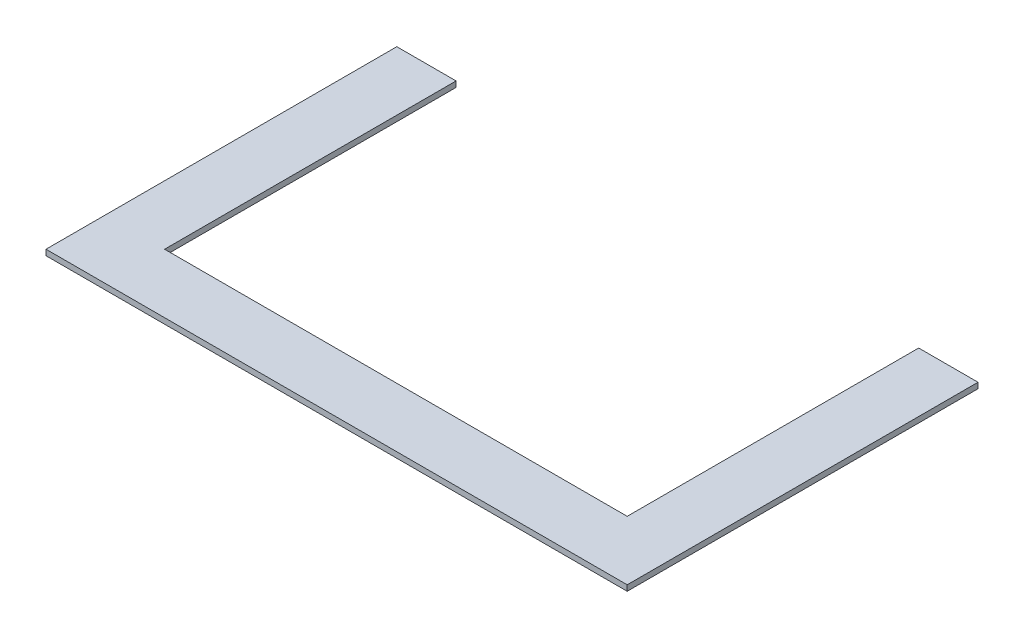
ISO-10303-21;
HEADER;
FILE_DESCRIPTION(('STEP AP214'),'2;1');
FILE_NAME('part.step','',(''),(''),'','','');
FILE_SCHEMA(('AUTOMOTIVE_DESIGN { 1 0 10303 214 1 1 1 1 }'));
ENDSEC;
DATA;
#1=APPLICATION_CONTEXT('core data for automotive mechanical design processes');
#2=APPLICATION_PROTOCOL_DEFINITION('international standard','automotive_design',2000,#1);
#3=PRODUCT_CONTEXT('',#1,'mechanical');
#4=PRODUCT('Part','Part','',(#3));
#5=PRODUCT_RELATED_PRODUCT_CATEGORY('part','',(#4));
#6=PRODUCT_DEFINITION_FORMATION('','',#4);
#7=PRODUCT_DEFINITION_CONTEXT('part definition',#1,'design');
#8=PRODUCT_DEFINITION('design','',#6,#7);
#9=PRODUCT_DEFINITION_SHAPE('','',#8);
#10=(LENGTH_UNIT() NAMED_UNIT(*) SI_UNIT(.MILLI.,.METRE.));
#11=(NAMED_UNIT(*) PLANE_ANGLE_UNIT() SI_UNIT($,.RADIAN.));
#12=(NAMED_UNIT(*) SI_UNIT($,.STERADIAN.) SOLID_ANGLE_UNIT());
#13=UNCERTAINTY_MEASURE_WITH_UNIT(LENGTH_MEASURE(1.E-05),#10,'distance_accuracy_value','');
#14=(GEOMETRIC_REPRESENTATION_CONTEXT(3) GLOBAL_UNCERTAINTY_ASSIGNED_CONTEXT((#13)) GLOBAL_UNIT_ASSIGNED_CONTEXT((#10,
#11,#12)) REPRESENTATION_CONTEXT('',''));
#15=CARTESIAN_POINT('',(0.,0.,0.));
#16=DIRECTION('',(0.,0.,1.));
#17=DIRECTION('',(1.,0.,0.));
#18=AXIS2_PLACEMENT_3D('',#15,#16,#17);
#19=CARTESIAN_POINT('',(-117.465606508876,1.8288,-70.5031294378698));
#20=DIRECTION('',(0.,0.,-1.));
#21=DIRECTION('',(-1.,0.,0.));
#22=AXIS2_PLACEMENT_3D('',#19,#20,#21);
#23=PLANE('',#22);
#24=DIRECTION('',(1.,0.,0.));
#25=VECTOR('',#24,1.);
#26=CARTESIAN_POINT('',(-117.465606508876,0.,-70.5031294378698));
#27=LINE('',#26,#25);
#28=CARTESIAN_POINT('',(-117.465606508876,0.,-70.5031294378698));
#29=VERTEX_POINT('',#28);
#30=CARTESIAN_POINT('',(-98.3140065088758,0.,-70.5031294378698));
#31=VERTEX_POINT('',#30);
#32=EDGE_CURVE('E129',#29,#31,#27,.T.);
#33=ORIENTED_EDGE('',*,*,#32,.F.);
#34=DIRECTION('',(0.,-1.,0.));
#35=VECTOR('',#34,1.);
#36=CARTESIAN_POINT('',(-117.465606508876,1.8288,-70.5031294378698));
#37=LINE('',#36,#35);
#38=CARTESIAN_POINT('',(-117.465606508876,1.8288,-70.5031294378698));
#39=VERTEX_POINT('',#38);
#40=EDGE_CURVE('E11',#39,#29,#37,.T.);
#41=ORIENTED_EDGE('',*,*,#40,.F.);
#42=DIRECTION('',(1.,0.,0.));
#43=VECTOR('',#42,1.);
#44=CARTESIAN_POINT('',(-117.465606508876,1.8288,-70.5031294378698));
#45=LINE('',#44,#43);
#46=CARTESIAN_POINT('',(-98.3140065088758,1.8288,-70.5031294378698));
#47=VERTEX_POINT('',#46);
#48=EDGE_CURVE('E149',#39,#47,#45,.T.);
#49=ORIENTED_EDGE('',*,*,#48,.T.);
#50=DIRECTION('',(0.,-1.,0.));
#51=VECTOR('',#50,1.);
#52=CARTESIAN_POINT('',(-98.3140065088758,1.8288,-70.5031294378698));
#53=LINE('',#52,#51);
#54=EDGE_CURVE('E35',#47,#31,#53,.T.);
#55=ORIENTED_EDGE('',*,*,#54,.T.);
#56=EDGE_LOOP('',(#33,#41,#49,#55));
#57=FACE_BOUND('',#56,.T.);
#58=ADVANCED_FACE('F32',(#57),#23,.T.);
#59=CARTESIAN_POINT('',(-117.465606508876,1.8288,42.8062705621302));
#60=DIRECTION('',(-1.,0.,0.));
#61=DIRECTION('',(0.,0.,1.));
#62=AXIS2_PLACEMENT_3D('',#59,#60,#61);
#63=PLANE('',#62);
#64=DIRECTION('',(0.,0.,-1.));
#65=VECTOR('',#64,1.);
#66=CARTESIAN_POINT('',(-117.465606508876,0.,42.8062705621302));
#67=LINE('',#66,#65);
#68=CARTESIAN_POINT('',(-117.465606508876,0.,42.8062705621302));
#69=VERTEX_POINT('',#68);
#70=EDGE_CURVE('E147',#69,#29,#67,.T.);
#71=ORIENTED_EDGE('',*,*,#70,.F.);
#72=DIRECTION('',(0.,-1.,0.));
#73=VECTOR('',#72,1.);
#74=CARTESIAN_POINT('',(-117.465606508876,1.8288,42.8062705621302));
#75=LINE('',#74,#73);
#76=CARTESIAN_POINT('',(-117.465606508876,1.8288,42.8062705621302));
#77=VERTEX_POINT('',#76);
#78=EDGE_CURVE('E41',#77,#69,#75,.T.);
#79=ORIENTED_EDGE('',*,*,#78,.F.);
#80=DIRECTION('',(0.,0.,-1.));
#81=VECTOR('',#80,1.);
#82=CARTESIAN_POINT('',(-117.465606508876,1.8288,42.8062705621302));
#83=LINE('',#82,#81);
#84=EDGE_CURVE('E119',#77,#39,#83,.T.);
#85=ORIENTED_EDGE('',*,*,#84,.T.);
#86=ORIENTED_EDGE('',*,*,#40,.T.);
#87=EDGE_LOOP('',(#71,#79,#85,#86));
#88=FACE_BOUND('',#87,.T.);
#89=ADVANCED_FACE('F161',(#88),#63,.T.);
#90=CARTESIAN_POINT('',(70.2657934911242,1.8288,42.8062705621302));
#91=DIRECTION('',(0.,0.,1.));
#92=DIRECTION('',(1.,0.,0.));
#93=AXIS2_PLACEMENT_3D('',#90,#91,#92);
#94=PLANE('',#93);
#95=DIRECTION('',(-1.,0.,0.));
#96=VECTOR('',#95,1.);
#97=CARTESIAN_POINT('',(70.2657934911242,0.,42.8062705621302));
#98=LINE('',#97,#96);
#99=CARTESIAN_POINT('',(70.2657934911242,0.,42.8062705621302));
#100=VERTEX_POINT('',#99);
#101=EDGE_CURVE('E106',#100,#69,#98,.T.);
#102=ORIENTED_EDGE('',*,*,#101,.F.);
#103=DIRECTION('',(0.,-1.,0.));
#104=VECTOR('',#103,1.);
#105=CARTESIAN_POINT('',(70.2657934911242,1.8288,42.8062705621302));
#106=LINE('',#105,#104);
#107=CARTESIAN_POINT('',(70.2657934911242,1.8288,42.8062705621302));
#108=VERTEX_POINT('',#107);
#109=EDGE_CURVE('E101',#108,#100,#106,.T.);
#110=ORIENTED_EDGE('',*,*,#109,.F.);
#111=DIRECTION('',(-1.,0.,0.));
#112=VECTOR('',#111,1.);
#113=CARTESIAN_POINT('',(70.2657934911242,1.8288,42.8062705621302));
#114=LINE('',#113,#112);
#115=EDGE_CURVE('E104',#108,#77,#114,.T.);
#116=ORIENTED_EDGE('',*,*,#115,.T.);
#117=ORIENTED_EDGE('',*,*,#78,.T.);
#118=EDGE_LOOP('',(#102,#110,#116,#117));
#119=FACE_BOUND('',#118,.T.);
#120=ADVANCED_FACE('F103',(#119),#94,.T.);
#121=CARTESIAN_POINT('',(70.2657934911242,1.8288,-70.5031294378698));
#122=DIRECTION('',(1.,0.,0.));
#123=DIRECTION('',(0.,0.,-1.));
#124=AXIS2_PLACEMENT_3D('',#121,#122,#123);
#125=PLANE('',#124);
#126=DIRECTION('',(0.,0.,1.));
#127=VECTOR('',#126,1.);
#128=CARTESIAN_POINT('',(70.2657934911242,0.,-70.5031294378698));
#129=LINE('',#128,#127);
#130=CARTESIAN_POINT('',(70.2657934911242,0.,-70.5031294378698));
#131=VERTEX_POINT('',#130);
#132=EDGE_CURVE('E144',#131,#100,#129,.T.);
#133=ORIENTED_EDGE('',*,*,#132,.F.);
#134=DIRECTION('',(0.,-1.,0.));
#135=VECTOR('',#134,1.);
#136=CARTESIAN_POINT('',(70.2657934911242,1.8288,-70.5031294378698));
#137=LINE('',#136,#135);
#138=CARTESIAN_POINT('',(70.2657934911242,1.8288,-70.5031294378698));
#139=VERTEX_POINT('',#138);
#140=EDGE_CURVE('E111',#139,#131,#137,.T.);
#141=ORIENTED_EDGE('',*,*,#140,.F.);
#142=DIRECTION('',(0.,0.,1.));
#143=VECTOR('',#142,1.);
#144=CARTESIAN_POINT('',(70.2657934911242,1.8288,-70.5031294378698));
#145=LINE('',#144,#143);
#146=EDGE_CURVE('E117',#139,#108,#145,.T.);
#147=ORIENTED_EDGE('',*,*,#146,.T.);
#148=ORIENTED_EDGE('',*,*,#109,.T.);
#149=EDGE_LOOP('',(#133,#141,#147,#148));
#150=FACE_BOUND('',#149,.T.);
#151=ADVANCED_FACE('F121',(#150),#125,.T.);
#152=CARTESIAN_POINT('',(51.1141934911242,1.8288,-70.5031294378698));
#153=DIRECTION('',(0.,0.,-1.));
#154=DIRECTION('',(-1.,0.,0.));
#155=AXIS2_PLACEMENT_3D('',#152,#153,#154);
#156=PLANE('',#155);
#157=DIRECTION('',(1.,0.,0.));
#158=VECTOR('',#157,1.);
#159=CARTESIAN_POINT('',(51.1141934911242,0.,-70.5031294378698));
#160=LINE('',#159,#158);
#161=CARTESIAN_POINT('',(51.1141934911242,0.,-70.5031294378698));
#162=VERTEX_POINT('',#161);
#163=EDGE_CURVE('E141',#162,#131,#160,.T.);
#164=ORIENTED_EDGE('',*,*,#163,.F.);
#165=DIRECTION('',(0.,-1.,0.));
#166=VECTOR('',#165,1.);
#167=CARTESIAN_POINT('',(51.1141934911242,1.8288,-70.5031294378698));
#168=LINE('',#167,#166);
#169=CARTESIAN_POINT('',(51.1141934911242,1.8288,-70.5031294378698));
#170=VERTEX_POINT('',#169);
#171=EDGE_CURVE('E153',#170,#162,#168,.T.);
#172=ORIENTED_EDGE('',*,*,#171,.F.);
#173=DIRECTION('',(1.,0.,0.));
#174=VECTOR('',#173,1.);
#175=CARTESIAN_POINT('',(51.1141934911242,1.8288,-70.5031294378698));
#176=LINE('',#175,#174);
#177=EDGE_CURVE('E122',#170,#139,#176,.T.);
#178=ORIENTED_EDGE('',*,*,#177,.T.);
#179=ORIENTED_EDGE('',*,*,#140,.T.);
#180=EDGE_LOOP('',(#164,#172,#178,#179));
#181=FACE_BOUND('',#180,.T.);
#182=ADVANCED_FACE('F174',(#181),#156,.T.);
#183=CARTESIAN_POINT('',(51.1141934911242,1.8288,23.6546705621302));
#184=DIRECTION('',(-1.,0.,0.));
#185=DIRECTION('',(0.,0.,1.));
#186=AXIS2_PLACEMENT_3D('',#183,#184,#185);
#187=PLANE('',#186);
#188=DIRECTION('',(0.,0.,-1.));
#189=VECTOR('',#188,1.);
#190=CARTESIAN_POINT('',(51.1141934911242,0.,23.6546705621302));
#191=LINE('',#190,#189);
#192=CARTESIAN_POINT('',(51.1141934911242,0.,23.6546705621302));
#193=VERTEX_POINT('',#192);
#194=EDGE_CURVE('E138',#193,#162,#191,.T.);
#195=ORIENTED_EDGE('',*,*,#194,.F.);
#196=DIRECTION('',(0.,-1.,0.));
#197=VECTOR('',#196,1.);
#198=CARTESIAN_POINT('',(51.1141934911242,1.8288,23.6546705621302));
#199=LINE('',#198,#197);
#200=CARTESIAN_POINT('',(51.1141934911242,1.8288,23.6546705621302));
#201=VERTEX_POINT('',#200);
#202=EDGE_CURVE('E155',#201,#193,#199,.T.);
#203=ORIENTED_EDGE('',*,*,#202,.F.);
#204=DIRECTION('',(0.,0.,-1.));
#205=VECTOR('',#204,1.);
#206=CARTESIAN_POINT('',(51.1141934911242,1.8288,23.6546705621302));
#207=LINE('',#206,#205);
#208=EDGE_CURVE('E124',#201,#170,#207,.T.);
#209=ORIENTED_EDGE('',*,*,#208,.T.);
#210=ORIENTED_EDGE('',*,*,#171,.T.);
#211=EDGE_LOOP('',(#195,#203,#209,#210));
#212=FACE_BOUND('',#211,.T.);
#213=ADVANCED_FACE('F177',(#212),#187,.T.);
#214=CARTESIAN_POINT('',(-98.3140065088758,1.8288,23.6546705621302));
#215=DIRECTION('',(0.,0.,-1.));
#216=DIRECTION('',(-1.,0.,0.));
#217=AXIS2_PLACEMENT_3D('',#214,#215,#216);
#218=PLANE('',#217);
#219=DIRECTION('',(1.,0.,0.));
#220=VECTOR('',#219,1.);
#221=CARTESIAN_POINT('',(-98.3140065088758,0.,23.6546705621302));
#222=LINE('',#221,#220);
#223=CARTESIAN_POINT('',(-98.3140065088758,0.,23.6546705621302));
#224=VERTEX_POINT('',#223);
#225=EDGE_CURVE('E135',#224,#193,#222,.T.);
#226=ORIENTED_EDGE('',*,*,#225,.F.);
#227=DIRECTION('',(0.,-1.,0.));
#228=VECTOR('',#227,1.);
#229=CARTESIAN_POINT('',(-98.3140065088758,1.8288,23.6546705621302));
#230=LINE('',#229,#228);
#231=CARTESIAN_POINT('',(-98.3140065088758,1.8288,23.6546705621302));
#232=VERTEX_POINT('',#231);
#233=EDGE_CURVE('E156',#232,#224,#230,.T.);
#234=ORIENTED_EDGE('',*,*,#233,.F.);
#235=DIRECTION('',(1.,0.,0.));
#236=VECTOR('',#235,1.);
#237=CARTESIAN_POINT('',(-98.3140065088758,1.8288,23.6546705621302));
#238=LINE('',#237,#236);
#239=EDGE_CURVE('E252',#232,#201,#238,.T.);
#240=ORIENTED_EDGE('',*,*,#239,.T.);
#241=ORIENTED_EDGE('',*,*,#202,.T.);
#242=EDGE_LOOP('',(#226,#234,#240,#241));
#243=FACE_BOUND('',#242,.T.);
#244=ADVANCED_FACE('F181',(#243),#218,.T.);
#245=CARTESIAN_POINT('',(-98.3140065088758,1.8288,-70.5031294378698));
#246=DIRECTION('',(1.,0.,0.));
#247=DIRECTION('',(0.,0.,-1.));
#248=AXIS2_PLACEMENT_3D('',#245,#246,#247);
#249=PLANE('',#248);
#250=DIRECTION('',(0.,0.,1.));
#251=VECTOR('',#250,1.);
#252=CARTESIAN_POINT('',(-98.3140065088758,0.,-70.5031294378698));
#253=LINE('',#252,#251);
#254=EDGE_CURVE('E132',#31,#224,#253,.T.);
#255=ORIENTED_EDGE('',*,*,#254,.F.);
#256=ORIENTED_EDGE('',*,*,#54,.F.);
#257=DIRECTION('',(0.,0.,1.));
#258=VECTOR('',#257,1.);
#259=CARTESIAN_POINT('',(-98.3140065088758,1.8288,-70.5031294378698));
#260=LINE('',#259,#258);
#261=EDGE_CURVE('E253',#47,#232,#260,.T.);
#262=ORIENTED_EDGE('',*,*,#261,.T.);
#263=ORIENTED_EDGE('',*,*,#233,.T.);
#264=EDGE_LOOP('',(#255,#256,#262,#263));
#265=FACE_BOUND('',#264,.T.);
#266=ADVANCED_FACE('F158',(#265),#249,.T.);
#267=CARTESIAN_POINT('',(0.,1.8288,0.));
#268=DIRECTION('',(0.,-1.,0.));
#269=DIRECTION('',(0.,0.,-1.));
#270=AXIS2_PLACEMENT_3D('',#267,#268,#269);
#271=PLANE('',#270);
#272=ORIENTED_EDGE('',*,*,#48,.F.);
#273=ORIENTED_EDGE('',*,*,#84,.F.);
#274=ORIENTED_EDGE('',*,*,#115,.F.);
#275=ORIENTED_EDGE('',*,*,#146,.F.);
#276=ORIENTED_EDGE('',*,*,#177,.F.);
#277=ORIENTED_EDGE('',*,*,#208,.F.);
#278=ORIENTED_EDGE('',*,*,#239,.F.);
#279=ORIENTED_EDGE('',*,*,#261,.F.);
#280=EDGE_LOOP('',(#272,#273,#274,#275,#276,#277,#278,#279));
#281=FACE_BOUND('',#280,.T.);
#282=ADVANCED_FACE('F115',(#281),#271,.F.);
#283=CARTESIAN_POINT('',(0.,0.,0.));
#284=DIRECTION('',(0.,-1.,0.));
#285=DIRECTION('',(0.,0.,-1.));
#286=AXIS2_PLACEMENT_3D('',#283,#284,#285);
#287=PLANE('',#286);
#288=ORIENTED_EDGE('',*,*,#32,.T.);
#289=ORIENTED_EDGE('',*,*,#254,.T.);
#290=ORIENTED_EDGE('',*,*,#225,.T.);
#291=ORIENTED_EDGE('',*,*,#194,.T.);
#292=ORIENTED_EDGE('',*,*,#163,.T.);
#293=ORIENTED_EDGE('',*,*,#132,.T.);
#294=ORIENTED_EDGE('',*,*,#101,.T.);
#295=ORIENTED_EDGE('',*,*,#70,.T.);
#296=EDGE_LOOP('',(#288,#289,#290,#291,#292,#293,#294,#295));
#297=FACE_BOUND('',#296,.T.);
#298=ADVANCED_FACE('F160',(#297),#287,.T.);
#299=CLOSED_SHELL('',(#58,#89,#120,#151,#182,#213,#244,#266,#282,#298));
#300=MANIFOLD_SOLID_BREP('B2',#299);
#301=ADVANCED_BREP_SHAPE_REPRESENTATION('',(#18,#300),#14);
#302=SHAPE_DEFINITION_REPRESENTATION(#9,#301);
ENDSEC;
END-ISO-10303-21;
